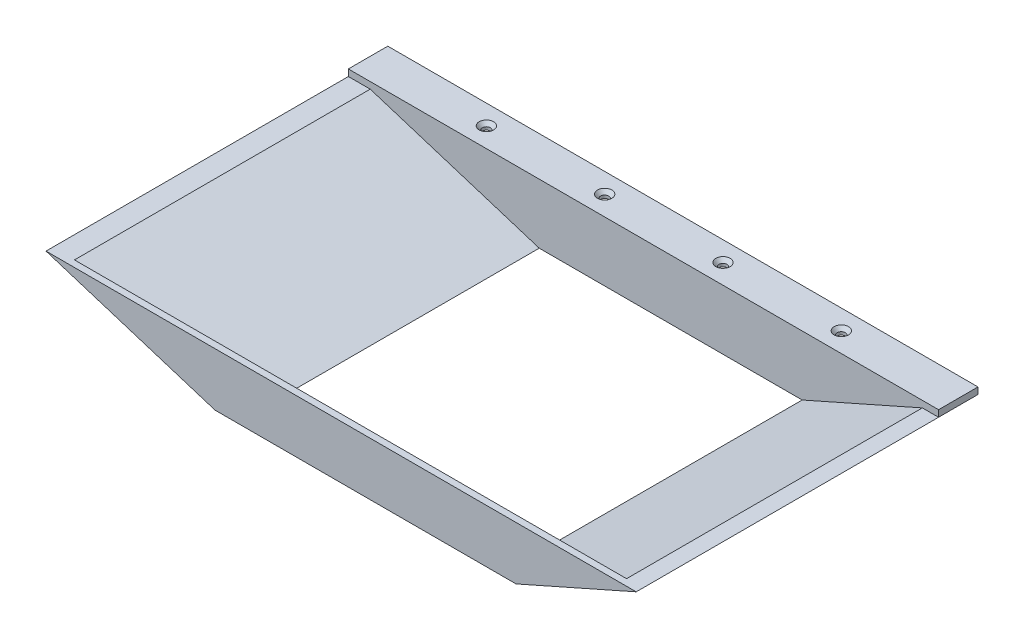
ISO-10303-21;
HEADER;
FILE_DESCRIPTION(('STEP AP214'),'2;1');
FILE_NAME('part.step','',(''),(''),'','','');
FILE_SCHEMA(('AUTOMOTIVE_DESIGN { 1 0 10303 214 1 1 1 1 }'));
ENDSEC;
DATA;
#1=APPLICATION_CONTEXT('core data for automotive mechanical design processes');
#2=APPLICATION_PROTOCOL_DEFINITION('international standard','automotive_design',2000,#1);
#3=PRODUCT_CONTEXT('',#1,'mechanical');
#4=PRODUCT('Part','Part','',(#3));
#5=PRODUCT_RELATED_PRODUCT_CATEGORY('part','',(#4));
#6=PRODUCT_DEFINITION_FORMATION('','',#4);
#7=PRODUCT_DEFINITION_CONTEXT('part definition',#1,'design');
#8=PRODUCT_DEFINITION('design','',#6,#7);
#9=PRODUCT_DEFINITION_SHAPE('','',#8);
#10=(LENGTH_UNIT() NAMED_UNIT(*) SI_UNIT(.MILLI.,.METRE.));
#11=(NAMED_UNIT(*) PLANE_ANGLE_UNIT() SI_UNIT($,.RADIAN.));
#12=(NAMED_UNIT(*) SI_UNIT($,.STERADIAN.) SOLID_ANGLE_UNIT());
#13=UNCERTAINTY_MEASURE_WITH_UNIT(LENGTH_MEASURE(1.E-05),#10,'distance_accuracy_value','');
#14=(GEOMETRIC_REPRESENTATION_CONTEXT(3) GLOBAL_UNCERTAINTY_ASSIGNED_CONTEXT((#13)) GLOBAL_UNIT_ASSIGNED_CONTEXT((#10,
#11,#12)) REPRESENTATION_CONTEXT('',''));
#15=CARTESIAN_POINT('',(0.,0.,0.));
#16=DIRECTION('',(0.,0.,1.));
#17=DIRECTION('',(1.,0.,0.));
#18=AXIS2_PLACEMENT_3D('',#15,#16,#17);
#19=CARTESIAN_POINT('',(0.,41.148,0.));
#20=DIRECTION('',(0.,1.,0.));
#21=DIRECTION('',(0.,0.,1.));
#22=AXIS2_PLACEMENT_3D('',#19,#20,#21);
#23=PLANE('',#22);
#24=DIRECTION('',(1.,0.,0.));
#25=VECTOR('',#24,1.);
#26=CARTESIAN_POINT('',(-249.139939759844,41.148,-114.3));
#27=LINE('',#26,#25);
#28=CARTESIAN_POINT('',(-249.139939759844,41.148,-114.3));
#29=VERTEX_POINT('',#28);
#30=CARTESIAN_POINT('',(-232.231438,41.148,-114.3));
#31=VERTEX_POINT('',#30);
#32=EDGE_CURVE('E63',#29,#31,#27,.T.);
#33=ORIENTED_EDGE('',*,*,#32,.F.);
#34=DIRECTION('',(0.,0.,1.));
#35=VECTOR('',#34,1.);
#36=CARTESIAN_POINT('',(-249.139939759844,41.148,0.));
#37=LINE('',#36,#35);
#38=CARTESIAN_POINT('',(-249.139939759844,41.148,119.38));
#39=VERTEX_POINT('',#38);
#40=EDGE_CURVE('E212',#29,#39,#37,.T.);
#41=ORIENTED_EDGE('',*,*,#40,.T.);
#42=DIRECTION('',(1.,0.,0.));
#43=VECTOR('',#42,1.);
#44=CARTESIAN_POINT('',(0.,41.148,119.38));
#45=LINE('',#44,#43);
#46=CARTESIAN_POINT('',(207.027983743236,41.148,119.38));
#47=VERTEX_POINT('',#46);
#48=EDGE_CURVE('E214',#39,#47,#45,.T.);
#49=ORIENTED_EDGE('',*,*,#48,.T.);
#50=DIRECTION('',(0.,0.,-1.));
#51=VECTOR('',#50,1.);
#52=CARTESIAN_POINT('',(207.027983743236,41.148,0.));
#53=LINE('',#52,#51);
#54=CARTESIAN_POINT('',(207.027983743236,41.148,-114.3));
#55=VERTEX_POINT('',#54);
#56=EDGE_CURVE('E217',#47,#55,#53,.T.);
#57=ORIENTED_EDGE('',*,*,#56,.T.);
#58=CARTESIAN_POINT('',(194.485768,41.148,-114.3));
#59=VERTEX_POINT('',#58);
#60=EDGE_CURVE('E12',#59,#55,#27,.T.);
#61=ORIENTED_EDGE('',*,*,#60,.F.);
#62=DIRECTION('',(0.,0.,-1.));
#63=VECTOR('',#62,1.);
#64=CARTESIAN_POINT('',(194.485768,41.148,-114.3));
#65=LINE('',#64,#63);
#66=CARTESIAN_POINT('',(194.485768,41.148,114.3));
#67=VERTEX_POINT('',#66);
#68=EDGE_CURVE('E187',#67,#59,#65,.T.);
#69=ORIENTED_EDGE('',*,*,#68,.F.);
#70=DIRECTION('',(1.,0.,0.));
#71=VECTOR('',#70,1.);
#72=CARTESIAN_POINT('',(-232.231438,41.148,114.3));
#73=LINE('',#72,#71);
#74=CARTESIAN_POINT('',(-232.231438,41.148,114.3));
#75=VERTEX_POINT('',#74);
#76=EDGE_CURVE('E191',#75,#67,#73,.T.);
#77=ORIENTED_EDGE('',*,*,#76,.F.);
#78=DIRECTION('',(0.,0.,1.));
#79=VECTOR('',#78,1.);
#80=CARTESIAN_POINT('',(-232.231438,41.148,-114.3));
#81=LINE('',#80,#79);
#82=EDGE_CURVE('E192',#31,#75,#81,.T.);
#83=ORIENTED_EDGE('',*,*,#82,.F.);
#84=EDGE_LOOP('',(#33,#41,#49,#57,#61,#69,#77,#83));
#85=FACE_BOUND('',#84,.T.);
#86=ADVANCED_FACE('F46',(#85),#23,.T.);
#87=CARTESIAN_POINT('',(0.,0.,0.));
#88=DIRECTION('',(0.,-1.,0.));
#89=DIRECTION('',(0.,0.,-1.));
#90=AXIS2_PLACEMENT_3D('',#87,#88,#89);
#91=PLANE('',#90);
#92=DIRECTION('',(0.,0.,-1.));
#93=VECTOR('',#92,1.);
#94=CARTESIAN_POINT('',(101.6,0.,114.3));
#95=LINE('',#94,#93);
#96=CARTESIAN_POINT('',(101.6,0.,114.3));
#97=VERTEX_POINT('',#96);
#98=CARTESIAN_POINT('',(101.6,0.,-114.3));
#99=VERTEX_POINT('',#98);
#100=EDGE_CURVE('E161',#97,#99,#95,.T.);
#101=ORIENTED_EDGE('',*,*,#100,.T.);
#102=DIRECTION('',(-1.,0.,0.));
#103=VECTOR('',#102,1.);
#104=CARTESIAN_POINT('',(-101.6,0.,-114.3));
#105=LINE('',#104,#103);
#106=CARTESIAN_POINT('',(-101.6,0.,-114.3));
#107=VERTEX_POINT('',#106);
#108=EDGE_CURVE('E164',#99,#107,#105,.T.);
#109=ORIENTED_EDGE('',*,*,#108,.T.);
#110=DIRECTION('',(0.,0.,1.));
#111=VECTOR('',#110,1.);
#112=CARTESIAN_POINT('',(-101.6,0.,114.3));
#113=LINE('',#112,#111);
#114=CARTESIAN_POINT('',(-101.6,0.,114.3));
#115=VERTEX_POINT('',#114);
#116=EDGE_CURVE('E238',#107,#115,#113,.T.);
#117=ORIENTED_EDGE('',*,*,#116,.T.);
#118=DIRECTION('',(1.,0.,0.));
#119=VECTOR('',#118,1.);
#120=CARTESIAN_POINT('',(-101.6,0.,114.3));
#121=LINE('',#120,#119);
#122=EDGE_CURVE('E290',#115,#97,#121,.T.);
#123=ORIENTED_EDGE('',*,*,#122,.T.);
#124=EDGE_LOOP('',(#101,#109,#117,#123));
#125=FACE_BOUND('',#124,.T.);
#126=DIRECTION('',(0.,0.,-1.));
#127=VECTOR('',#126,1.);
#128=CARTESIAN_POINT('',(114.142215743236,0.,0.));
#129=LINE('',#128,#127);
#130=CARTESIAN_POINT('',(114.142215743236,0.,119.38));
#131=VERTEX_POINT('',#130);
#132=CARTESIAN_POINT('',(114.142215743236,0.,-119.38));
#133=VERTEX_POINT('',#132);
#134=EDGE_CURVE('E190',#131,#133,#129,.T.);
#135=ORIENTED_EDGE('',*,*,#134,.F.);
#136=DIRECTION('',(1.,0.,0.));
#137=VECTOR('',#136,1.);
#138=CARTESIAN_POINT('',(0.,-1.34386598499686E-13,119.38));
#139=LINE('',#138,#137);
#140=CARTESIAN_POINT('',(-118.508501759844,0.,119.38));
#141=VERTEX_POINT('',#140);
#142=EDGE_CURVE('E205',#141,#131,#139,.T.);
#143=ORIENTED_EDGE('',*,*,#142,.F.);
#144=DIRECTION('',(0.,0.,1.));
#145=VECTOR('',#144,1.);
#146=CARTESIAN_POINT('',(-118.508501759844,0.,0.));
#147=LINE('',#146,#145);
#148=CARTESIAN_POINT('',(-118.508501759844,0.,-119.38));
#149=VERTEX_POINT('',#148);
#150=EDGE_CURVE('E224',#149,#141,#147,.T.);
#151=ORIENTED_EDGE('',*,*,#150,.F.);
#152=DIRECTION('',(-1.,0.,0.));
#153=VECTOR('',#152,1.);
#154=CARTESIAN_POINT('',(0.,0.,-119.38));
#155=LINE('',#154,#153);
#156=EDGE_CURVE('E227',#133,#149,#155,.T.);
#157=ORIENTED_EDGE('',*,*,#156,.F.);
#158=EDGE_LOOP('',(#135,#143,#151,#157));
#159=FACE_BOUND('',#158,.T.);
#160=ADVANCED_FACE('F244',(#125,#159),#91,.T.);
#161=CARTESIAN_POINT('',(0.,-1.34386598499686E-13,119.38));
#162=DIRECTION('',(0.,0.,1.));
#163=DIRECTION('',(0.,-1.,0.));
#164=AXIS2_PLACEMENT_3D('',#161,#162,#163);
#165=PLANE('',#164);
#166=DIRECTION('',(0.914302464587744,0.405032101504038,0.));
#167=VECTOR('',#166,1.);
#168=CARTESIAN_POINT('',(18.7251450057162,-42.269356342163,119.38));
#169=LINE('',#168,#167);
#170=EDGE_CURVE('E201',#131,#47,#169,.T.);
#171=ORIENTED_EDGE('',*,*,#170,.T.);
#172=ORIENTED_EDGE('',*,*,#48,.F.);
#173=DIRECTION('',(-0.95380053500612,0.300440575525409,0.));
#174=VECTOR('',#173,1.);
#175=CARTESIAN_POINT('',(-10.6971153289482,-33.9598414958772,119.38));
#176=LINE('',#175,#174);
#177=EDGE_CURVE('E204',#141,#39,#176,.T.);
#178=ORIENTED_EDGE('',*,*,#177,.F.);
#179=ORIENTED_EDGE('',*,*,#142,.T.);
#180=EDGE_LOOP('',(#171,#172,#178,#179));
#181=FACE_BOUND('',#180,.T.);
#182=ADVANCED_FACE('F254',(#181),#165,.T.);
#183=CARTESIAN_POINT('',(-10.6971153289483,-33.9598414958772,0.));
#184=DIRECTION('',(0.300440575525409,0.95380053500612,0.));
#185=DIRECTION('',(-0.95380053500612,0.300440575525409,0.));
#186=AXIS2_PLACEMENT_3D('',#183,#184,#185);
#187=PLANE('',#186);
#188=ORIENTED_EDGE('',*,*,#177,.T.);
#189=ORIENTED_EDGE('',*,*,#40,.F.);
#190=CARTESIAN_POINT('',(-249.139939759844,41.148,-119.38));
#191=VERTEX_POINT('',#190);
#192=EDGE_CURVE('E160',#191,#29,#37,.T.);
#193=ORIENTED_EDGE('',*,*,#192,.F.);
#194=DIRECTION('',(-0.95380053500612,0.300440575525409,0.));
#195=VECTOR('',#194,1.);
#196=CARTESIAN_POINT('',(-10.6971153289483,-33.9598414958772,-119.38));
#197=LINE('',#196,#195);
#198=EDGE_CURVE('E209',#149,#191,#197,.T.);
#199=ORIENTED_EDGE('',*,*,#198,.F.);
#200=ORIENTED_EDGE('',*,*,#150,.T.);
#201=EDGE_LOOP('',(#188,#189,#193,#199,#200));
#202=FACE_BOUND('',#201,.T.);
#203=ADVANCED_FACE('F456',(#202),#187,.F.);
#204=CARTESIAN_POINT('',(18.7251450057163,-42.2693563421629,0.));
#205=DIRECTION('',(-0.405032101504038,0.914302464587744,0.));
#206=DIRECTION('',(-0.914302464587744,-0.405032101504038,0.));
#207=AXIS2_PLACEMENT_3D('',#204,#205,#206);
#208=PLANE('',#207);
#209=DIRECTION('',(0.914302464587744,0.405032101504038,0.));
#210=VECTOR('',#209,1.);
#211=CARTESIAN_POINT('',(18.7251450057162,-42.269356342163,-119.38));
#212=LINE('',#211,#210);
#213=CARTESIAN_POINT('',(207.027983743236,41.148,-119.38));
#214=VERTEX_POINT('',#213);
#215=EDGE_CURVE('E208',#133,#214,#212,.T.);
#216=ORIENTED_EDGE('',*,*,#215,.T.);
#217=DIRECTION('',(0.,0.,-1.));
#218=VECTOR('',#217,1.);
#219=CARTESIAN_POINT('',(207.027983743236,41.148,-114.3));
#220=LINE('',#219,#218);
#221=EDGE_CURVE('E180',#55,#214,#220,.T.);
#222=ORIENTED_EDGE('',*,*,#221,.F.);
#223=ORIENTED_EDGE('',*,*,#56,.F.);
#224=ORIENTED_EDGE('',*,*,#170,.F.);
#225=ORIENTED_EDGE('',*,*,#134,.T.);
#226=EDGE_LOOP('',(#216,#222,#223,#224,#225));
#227=FACE_BOUND('',#226,.T.);
#228=ADVANCED_FACE('F365',(#227),#208,.F.);
#229=CARTESIAN_POINT('',(0.,0.,-119.38));
#230=DIRECTION('',(0.,0.,-1.));
#231=DIRECTION('',(0.,1.,0.));
#232=AXIS2_PLACEMENT_3D('',#229,#230,#231);
#233=PLANE('',#232);
#234=ORIENTED_EDGE('',*,*,#198,.T.);
#235=DIRECTION('',(-1.,0.,0.));
#236=VECTOR('',#235,1.);
#237=CARTESIAN_POINT('',(0.,41.148,-119.38));
#238=LINE('',#237,#236);
#239=EDGE_CURVE('E55',#214,#191,#238,.T.);
#240=ORIENTED_EDGE('',*,*,#239,.F.);
#241=ORIENTED_EDGE('',*,*,#215,.F.);
#242=ORIENTED_EDGE('',*,*,#156,.T.);
#243=EDGE_LOOP('',(#234,#240,#241,#242));
#244=FACE_BOUND('',#243,.T.);
#245=ADVANCED_FACE('F48',(#244),#233,.T.);
#246=CARTESIAN_POINT('',(0.,-1.28668019840125E-13,114.3));
#247=DIRECTION('',(0.,0.,1.));
#248=DIRECTION('',(0.,-1.,0.));
#249=AXIS2_PLACEMENT_3D('',#246,#247,#248);
#250=PLANE('',#249);
#251=DIRECTION('',(0.914302464587744,0.405032101504038,0.));
#252=VECTOR('',#251,1.);
#253=CARTESIAN_POINT('',(101.6,0.,114.3));
#254=LINE('',#253,#252);
#255=EDGE_CURVE('E292',#97,#67,#254,.T.);
#256=ORIENTED_EDGE('',*,*,#255,.F.);
#257=ORIENTED_EDGE('',*,*,#122,.F.);
#258=DIRECTION('',(-0.95380053500612,0.300440575525409,0.));
#259=VECTOR('',#258,1.);
#260=CARTESIAN_POINT('',(-101.6,0.,114.3));
#261=LINE('',#260,#259);
#262=EDGE_CURVE('E174',#115,#75,#261,.T.);
#263=ORIENTED_EDGE('',*,*,#262,.T.);
#264=ORIENTED_EDGE('',*,*,#76,.T.);
#265=EDGE_LOOP('',(#256,#257,#263,#264));
#266=FACE_BOUND('',#265,.T.);
#267=ADVANCED_FACE('F356',(#266),#250,.F.);
#268=CARTESIAN_POINT('',(-9.17087720527918,-29.1145347780461,0.));
#269=DIRECTION('',(0.300440575525409,0.95380053500612,0.));
#270=DIRECTION('',(-0.95380053500612,0.300440575525409,0.));
#271=AXIS2_PLACEMENT_3D('',#268,#269,#270);
#272=PLANE('',#271);
#273=ORIENTED_EDGE('',*,*,#262,.F.);
#274=ORIENTED_EDGE('',*,*,#116,.F.);
#275=DIRECTION('',(-0.95380053500612,0.300440575525409,0.));
#276=VECTOR('',#275,1.);
#277=CARTESIAN_POINT('',(-101.6,0.,-114.3));
#278=LINE('',#277,#276);
#279=EDGE_CURVE('E330',#107,#31,#278,.T.);
#280=ORIENTED_EDGE('',*,*,#279,.T.);
#281=ORIENTED_EDGE('',*,*,#82,.T.);
#282=EDGE_LOOP('',(#273,#274,#280,#281));
#283=FACE_BOUND('',#282,.T.);
#284=ADVANCED_FACE('F310',(#283),#272,.T.);
#285=CARTESIAN_POINT('',(16.6675819300758,-37.6246998220572,0.));
#286=DIRECTION('',(-0.405032101504038,0.914302464587744,0.));
#287=DIRECTION('',(-0.914302464587744,-0.405032101504038,0.));
#288=AXIS2_PLACEMENT_3D('',#285,#286,#287);
#289=PLANE('',#288);
#290=DIRECTION('',(0.914302464587744,0.405032101504038,0.));
#291=VECTOR('',#290,1.);
#292=CARTESIAN_POINT('',(101.6,0.,-114.3));
#293=LINE('',#292,#291);
#294=EDGE_CURVE('E322',#99,#59,#293,.T.);
#295=ORIENTED_EDGE('',*,*,#294,.F.);
#296=ORIENTED_EDGE('',*,*,#100,.F.);
#297=ORIENTED_EDGE('',*,*,#255,.T.);
#298=ORIENTED_EDGE('',*,*,#68,.T.);
#299=EDGE_LOOP('',(#295,#296,#297,#298));
#300=FACE_BOUND('',#299,.T.);
#301=ADVANCED_FACE('F301',(#300),#289,.T.);
#302=CARTESIAN_POINT('',(0.,0.,-114.3));
#303=DIRECTION('',(0.,0.,-1.));
#304=DIRECTION('',(0.,1.,0.));
#305=AXIS2_PLACEMENT_3D('',#302,#303,#304);
#306=PLANE('',#305);
#307=ORIENTED_EDGE('',*,*,#279,.F.);
#308=ORIENTED_EDGE('',*,*,#108,.F.);
#309=ORIENTED_EDGE('',*,*,#294,.T.);
#310=ORIENTED_EDGE('',*,*,#60,.T.);
#311=DIRECTION('',(0.,-1.,0.));
#312=VECTOR('',#311,1.);
#313=CARTESIAN_POINT('',(207.027983743236,46.228,-114.3));
#314=LINE('',#313,#312);
#315=CARTESIAN_POINT('',(207.027983743236,46.228,-114.3));
#316=VERTEX_POINT('',#315);
#317=EDGE_CURVE('E142',#316,#55,#314,.T.);
#318=ORIENTED_EDGE('',*,*,#317,.F.);
#319=DIRECTION('',(1.,0.,0.));
#320=VECTOR('',#319,1.);
#321=CARTESIAN_POINT('',(-249.139939759844,46.228,-114.3));
#322=LINE('',#321,#320);
#323=CARTESIAN_POINT('',(-249.139939759844,46.228,-114.3));
#324=VERTEX_POINT('',#323);
#325=EDGE_CURVE('E136',#324,#316,#322,.T.);
#326=ORIENTED_EDGE('',*,*,#325,.F.);
#327=DIRECTION('',(0.,-1.,0.));
#328=VECTOR('',#327,1.);
#329=CARTESIAN_POINT('',(-249.139939759844,46.228,-114.3));
#330=LINE('',#329,#328);
#331=EDGE_CURVE('E140',#324,#29,#330,.T.);
#332=ORIENTED_EDGE('',*,*,#331,.T.);
#333=ORIENTED_EDGE('',*,*,#32,.T.);
#334=EDGE_LOOP('',(#307,#308,#309,#310,#318,#326,#332,#333));
#335=FACE_BOUND('',#334,.T.);
#336=ADVANCED_FACE('F138',(#335),#306,.F.);
#337=CARTESIAN_POINT('',(-249.139939759844,46.228,-114.3));
#338=DIRECTION('',(1.,0.,0.));
#339=DIRECTION('',(0.,0.,-1.));
#340=AXIS2_PLACEMENT_3D('',#337,#338,#339);
#341=PLANE('',#340);
#342=DIRECTION('',(0.,0.,1.));
#343=VECTOR('',#342,1.);
#344=CARTESIAN_POINT('',(-249.139939759844,41.148,-114.3));
#345=LINE('',#344,#343);
#346=CARTESIAN_POINT('',(-249.139939759844,41.148,-144.78));
#347=VERTEX_POINT('',#346);
#348=EDGE_CURVE('E173',#347,#191,#345,.T.);
#349=ORIENTED_EDGE('',*,*,#348,.T.);
#350=ORIENTED_EDGE('',*,*,#192,.T.);
#351=ORIENTED_EDGE('',*,*,#331,.F.);
#352=DIRECTION('',(0.,0.,1.));
#353=VECTOR('',#352,1.);
#354=CARTESIAN_POINT('',(-249.139939759844,46.228,-114.3));
#355=LINE('',#354,#353);
#356=CARTESIAN_POINT('',(-249.139939759844,46.228,-144.78));
#357=VERTEX_POINT('',#356);
#358=EDGE_CURVE('E146',#357,#324,#355,.T.);
#359=ORIENTED_EDGE('',*,*,#358,.F.);
#360=DIRECTION('',(0.,-1.,0.));
#361=VECTOR('',#360,1.);
#362=CARTESIAN_POINT('',(-249.139939759844,46.228,-144.78));
#363=LINE('',#362,#361);
#364=EDGE_CURVE('E382',#357,#347,#363,.T.);
#365=ORIENTED_EDGE('',*,*,#364,.T.);
#366=EDGE_LOOP('',(#349,#350,#351,#359,#365));
#367=FACE_BOUND('',#366,.T.);
#368=ADVANCED_FACE('F159',(#367),#341,.F.);
#369=CARTESIAN_POINT('',(207.027983743236,46.228,-114.3));
#370=DIRECTION('',(-1.,0.,0.));
#371=DIRECTION('',(0.,0.,1.));
#372=AXIS2_PLACEMENT_3D('',#369,#370,#371);
#373=PLANE('',#372);
#374=ORIENTED_EDGE('',*,*,#221,.T.);
#375=CARTESIAN_POINT('',(207.027983743236,41.148,-144.78));
#376=VERTEX_POINT('',#375);
#377=EDGE_CURVE('E172',#214,#376,#220,.T.);
#378=ORIENTED_EDGE('',*,*,#377,.T.);
#379=DIRECTION('',(0.,-1.,0.));
#380=VECTOR('',#379,1.);
#381=CARTESIAN_POINT('',(207.027983743236,46.228,-144.78));
#382=LINE('',#381,#380);
#383=CARTESIAN_POINT('',(207.027983743236,46.228,-144.78));
#384=VERTEX_POINT('',#383);
#385=EDGE_CURVE('E166',#384,#376,#382,.T.);
#386=ORIENTED_EDGE('',*,*,#385,.F.);
#387=DIRECTION('',(0.,0.,-1.));
#388=VECTOR('',#387,1.);
#389=CARTESIAN_POINT('',(207.027983743236,46.228,-114.3));
#390=LINE('',#389,#388);
#391=EDGE_CURVE('E145',#316,#384,#390,.T.);
#392=ORIENTED_EDGE('',*,*,#391,.F.);
#393=ORIENTED_EDGE('',*,*,#317,.T.);
#394=EDGE_LOOP('',(#374,#378,#386,#392,#393));
#395=FACE_BOUND('',#394,.T.);
#396=ADVANCED_FACE('F379',(#395),#373,.F.);
#397=CARTESIAN_POINT('',(-249.139939759844,46.228,-144.78));
#398=DIRECTION('',(0.,0.,1.));
#399=DIRECTION('',(1.,0.,0.));
#400=AXIS2_PLACEMENT_3D('',#397,#398,#399);
#401=PLANE('',#400);
#402=DIRECTION('',(-1.,0.,0.));
#403=VECTOR('',#402,1.);
#404=CARTESIAN_POINT('',(-249.139939759844,41.148,-144.78));
#405=LINE('',#404,#403);
#406=EDGE_CURVE('E155',#376,#347,#405,.T.);
#407=ORIENTED_EDGE('',*,*,#406,.T.);
#408=ORIENTED_EDGE('',*,*,#364,.F.);
#409=DIRECTION('',(-1.,0.,0.));
#410=VECTOR('',#409,1.);
#411=CARTESIAN_POINT('',(-249.139939759844,46.228,-144.78));
#412=LINE('',#411,#410);
#413=EDGE_CURVE('E151',#384,#357,#412,.T.);
#414=ORIENTED_EDGE('',*,*,#413,.F.);
#415=ORIENTED_EDGE('',*,*,#385,.T.);
#416=EDGE_LOOP('',(#407,#408,#414,#415));
#417=FACE_BOUND('',#416,.T.);
#418=ADVANCED_FACE('F383',(#417),#401,.F.);
#419=CARTESIAN_POINT('',(0.,46.228,0.));
#420=DIRECTION('',(0.,-1.,0.));
#421=DIRECTION('',(0.,0.,-1.));
#422=AXIS2_PLACEMENT_3D('',#419,#420,#421);
#423=PLANE('',#422);
#424=CARTESIAN_POINT('',(-157.699939759844,46.228,-129.54));
#425=DIRECTION('',(0.,1.,0.));
#426=DIRECTION('',(0.,0.,1.));
#427=AXIS2_PLACEMENT_3D('',#424,#425,#426);
#428=CIRCLE('',#427,5.5626);
#429=CARTESIAN_POINT('',(-157.699939759844,46.228,-123.9774));
#430=VERTEX_POINT('',#429);
#431=EDGE_CURVE('E410',#430,#430,#428,.T.);
#432=ORIENTED_EDGE('',*,*,#431,.F.);
#433=EDGE_LOOP('',(#432));
#434=FACE_BOUND('',#433,.T.);
#435=CARTESIAN_POINT('',(-66.2599397598442,46.228,-129.54));
#436=DIRECTION('',(0.,1.,0.));
#437=DIRECTION('',(0.,0.,1.));
#438=AXIS2_PLACEMENT_3D('',#435,#436,#437);
#439=CIRCLE('',#438,5.5626);
#440=CARTESIAN_POINT('',(-66.2599397598442,46.228,-123.9774));
#441=VERTEX_POINT('',#440);
#442=EDGE_CURVE('E404',#441,#441,#439,.T.);
#443=ORIENTED_EDGE('',*,*,#442,.F.);
#444=EDGE_LOOP('',(#443));
#445=FACE_BOUND('',#444,.T.);
#446=CARTESIAN_POINT('',(25.1800602401557,46.228,-129.54));
#447=DIRECTION('',(0.,1.,0.));
#448=DIRECTION('',(0.,0.,1.));
#449=AXIS2_PLACEMENT_3D('',#446,#447,#448);
#450=CIRCLE('',#449,5.5626);
#451=CARTESIAN_POINT('',(25.1800602401557,46.228,-123.9774));
#452=VERTEX_POINT('',#451);
#453=EDGE_CURVE('E397',#452,#452,#450,.T.);
#454=ORIENTED_EDGE('',*,*,#453,.F.);
#455=EDGE_LOOP('',(#454));
#456=FACE_BOUND('',#455,.T.);
#457=CARTESIAN_POINT('',(116.620060240156,46.228,-129.54));
#458=DIRECTION('',(0.,1.,0.));
#459=DIRECTION('',(0.,0.,1.));
#460=AXIS2_PLACEMENT_3D('',#457,#458,#459);
#461=CIRCLE('',#460,5.5626);
#462=CARTESIAN_POINT('',(116.620060240156,46.228,-123.9774));
#463=VERTEX_POINT('',#462);
#464=EDGE_CURVE('E390',#463,#463,#461,.T.);
#465=ORIENTED_EDGE('',*,*,#464,.F.);
#466=EDGE_LOOP('',(#465));
#467=FACE_BOUND('',#466,.T.);
#468=ORIENTED_EDGE('',*,*,#358,.T.);
#469=ORIENTED_EDGE('',*,*,#325,.T.);
#470=ORIENTED_EDGE('',*,*,#391,.T.);
#471=ORIENTED_EDGE('',*,*,#413,.T.);
#472=EDGE_LOOP('',(#468,#469,#470,#471));
#473=FACE_BOUND('',#472,.T.);
#474=ADVANCED_FACE('F149',(#434,#445,#456,#467,#473),#423,.F.);
#475=CARTESIAN_POINT('',(0.,41.148,0.));
#476=DIRECTION('',(0.,-1.,0.));
#477=DIRECTION('',(0.,0.,-1.));
#478=AXIS2_PLACEMENT_3D('',#475,#476,#477);
#479=PLANE('',#478);
#480=CARTESIAN_POINT('',(-157.699939759844,41.148,-129.54));
#481=DIRECTION('',(0.,-1.,0.));
#482=DIRECTION('',(0.,0.,-1.));
#483=AXIS2_PLACEMENT_3D('',#480,#481,#482);
#484=CIRCLE('',#483,3.12419999999999);
#485=CARTESIAN_POINT('',(-157.699939759844,41.148,-132.6642));
#486=VERTEX_POINT('',#485);
#487=EDGE_CURVE('E50',#486,#486,#484,.T.);
#488=ORIENTED_EDGE('',*,*,#487,.F.);
#489=EDGE_LOOP('',(#488));
#490=FACE_BOUND('',#489,.T.);
#491=CARTESIAN_POINT('',(-66.2599397598442,41.148,-129.54));
#492=DIRECTION('',(0.,-1.,0.));
#493=DIRECTION('',(0.,0.,-1.));
#494=AXIS2_PLACEMENT_3D('',#491,#492,#493);
#495=CIRCLE('',#494,3.12419999999999);
#496=CARTESIAN_POINT('',(-66.2599397598442,41.148,-132.6642));
#497=VERTEX_POINT('',#496);
#498=EDGE_CURVE('E400',#497,#497,#495,.T.);
#499=ORIENTED_EDGE('',*,*,#498,.F.);
#500=EDGE_LOOP('',(#499));
#501=FACE_BOUND('',#500,.T.);
#502=CARTESIAN_POINT('',(25.1800602401557,41.148,-129.54));
#503=DIRECTION('',(0.,-1.,0.));
#504=DIRECTION('',(0.,0.,-1.));
#505=AXIS2_PLACEMENT_3D('',#502,#503,#504);
#506=CIRCLE('',#505,3.1242);
#507=CARTESIAN_POINT('',(25.1800602401557,41.148,-132.6642));
#508=VERTEX_POINT('',#507);
#509=EDGE_CURVE('E393',#508,#508,#506,.T.);
#510=ORIENTED_EDGE('',*,*,#509,.F.);
#511=EDGE_LOOP('',(#510));
#512=FACE_BOUND('',#511,.T.);
#513=CARTESIAN_POINT('',(116.620060240156,41.148,-129.54));
#514=DIRECTION('',(0.,-1.,0.));
#515=DIRECTION('',(0.,0.,-1.));
#516=AXIS2_PLACEMENT_3D('',#513,#514,#515);
#517=CIRCLE('',#516,3.12419999999999);
#518=CARTESIAN_POINT('',(116.620060240156,41.148,-132.6642));
#519=VERTEX_POINT('',#518);
#520=EDGE_CURVE('E389',#519,#519,#517,.T.);
#521=ORIENTED_EDGE('',*,*,#520,.F.);
#522=EDGE_LOOP('',(#521));
#523=FACE_BOUND('',#522,.T.);
#524=ORIENTED_EDGE('',*,*,#377,.F.);
#525=ORIENTED_EDGE('',*,*,#239,.T.);
#526=ORIENTED_EDGE('',*,*,#348,.F.);
#527=ORIENTED_EDGE('',*,*,#406,.F.);
#528=EDGE_LOOP('',(#524,#525,#526,#527));
#529=FACE_BOUND('',#528,.T.);
#530=ADVANCED_FACE('F375',(#490,#501,#512,#523,#529),#479,.T.);
#531=CARTESIAN_POINT('',(116.620060240156,46.228,-129.54));
#532=DIRECTION('',(0.,1.,0.));
#533=DIRECTION('',(0.,0.,1.));
#534=AXIS2_PLACEMENT_3D('',#531,#532,#533);
#535=CYLINDRICAL_SURFACE('',#534,3.12419999999999);
#536=ORIENTED_EDGE('',*,*,#520,.T.);
#537=EDGE_LOOP('',(#536));
#538=FACE_BOUND('',#537,.T.);
#539=CARTESIAN_POINT('',(116.620060240156,43.4229416758323,-129.54));
#540=DIRECTION('',(0.,1.,0.));
#541=DIRECTION('',(0.,0.,1.));
#542=AXIS2_PLACEMENT_3D('',#539,#540,#541);
#543=CIRCLE('',#542,3.12419999999999);
#544=CARTESIAN_POINT('',(116.620060240156,43.4229416758323,-126.4158));
#545=VERTEX_POINT('',#544);
#546=EDGE_CURVE('E386',#545,#545,#543,.T.);
#547=ORIENTED_EDGE('',*,*,#546,.T.);
#548=EDGE_LOOP('',(#547));
#549=FACE_BOUND('',#548,.T.);
#550=ADVANCED_FACE('F428',(#538,#549),#535,.F.);
#551=CARTESIAN_POINT('',(116.620060240156,46.228,-129.54));
#552=DIRECTION('',(0.,1.,0.));
#553=DIRECTION('',(0.,0.,1.));
#554=AXIS2_PLACEMENT_3D('',#551,#552,#553);
#555=CONICAL_SURFACE('',#554,5.5626,0.715584993317677);
#556=ORIENTED_EDGE('',*,*,#546,.F.);
#557=EDGE_LOOP('',(#556));
#558=FACE_BOUND('',#557,.T.);
#559=ORIENTED_EDGE('',*,*,#464,.T.);
#560=EDGE_LOOP('',(#559));
#561=FACE_BOUND('',#560,.T.);
#562=ADVANCED_FACE('F425',(#558,#561),#555,.F.);
#563=CARTESIAN_POINT('',(25.1800602401557,46.228,-129.54));
#564=DIRECTION('',(0.,1.,0.));
#565=DIRECTION('',(0.,0.,1.));
#566=AXIS2_PLACEMENT_3D('',#563,#564,#565);
#567=CYLINDRICAL_SURFACE('',#566,3.1242);
#568=ORIENTED_EDGE('',*,*,#509,.T.);
#569=EDGE_LOOP('',(#568));
#570=FACE_BOUND('',#569,.T.);
#571=CARTESIAN_POINT('',(25.1800602401557,43.4229416758323,-129.54));
#572=DIRECTION('',(0.,1.,0.));
#573=DIRECTION('',(0.,0.,1.));
#574=AXIS2_PLACEMENT_3D('',#571,#572,#573);
#575=CIRCLE('',#574,3.1242);
#576=CARTESIAN_POINT('',(25.1800602401557,43.4229416758323,-126.4158));
#577=VERTEX_POINT('',#576);
#578=EDGE_CURVE('E394',#577,#577,#575,.T.);
#579=ORIENTED_EDGE('',*,*,#578,.T.);
#580=EDGE_LOOP('',(#579));
#581=FACE_BOUND('',#580,.T.);
#582=ADVANCED_FACE('F427',(#570,#581),#567,.F.);
#583=CARTESIAN_POINT('',(25.1800602401557,46.228,-129.54));
#584=DIRECTION('',(0.,1.,0.));
#585=DIRECTION('',(0.,0.,1.));
#586=AXIS2_PLACEMENT_3D('',#583,#584,#585);
#587=CONICAL_SURFACE('',#586,5.5626,0.715584993317676);
#588=ORIENTED_EDGE('',*,*,#578,.F.);
#589=EDGE_LOOP('',(#588));
#590=FACE_BOUND('',#589,.T.);
#591=ORIENTED_EDGE('',*,*,#453,.T.);
#592=EDGE_LOOP('',(#591));
#593=FACE_BOUND('',#592,.T.);
#594=ADVANCED_FACE('F435',(#590,#593),#587,.F.);
#595=CARTESIAN_POINT('',(-66.2599397598442,46.228,-129.54));
#596=DIRECTION('',(0.,1.,0.));
#597=DIRECTION('',(0.,0.,1.));
#598=AXIS2_PLACEMENT_3D('',#595,#596,#597);
#599=CYLINDRICAL_SURFACE('',#598,3.12419999999999);
#600=ORIENTED_EDGE('',*,*,#498,.T.);
#601=EDGE_LOOP('',(#600));
#602=FACE_BOUND('',#601,.T.);
#603=CARTESIAN_POINT('',(-66.2599397598442,43.4229416758323,-129.54));
#604=DIRECTION('',(0.,1.,0.));
#605=DIRECTION('',(0.,0.,1.));
#606=AXIS2_PLACEMENT_3D('',#603,#604,#605);
#607=CIRCLE('',#606,3.12419999999999);
#608=CARTESIAN_POINT('',(-66.2599397598442,43.4229416758323,-126.4158));
#609=VERTEX_POINT('',#608);
#610=EDGE_CURVE('E401',#609,#609,#607,.T.);
#611=ORIENTED_EDGE('',*,*,#610,.T.);
#612=EDGE_LOOP('',(#611));
#613=FACE_BOUND('',#612,.T.);
#614=ADVANCED_FACE('F543',(#602,#613),#599,.F.);
#615=CARTESIAN_POINT('',(-66.2599397598442,46.228,-129.54));
#616=DIRECTION('',(0.,1.,0.));
#617=DIRECTION('',(0.,0.,1.));
#618=AXIS2_PLACEMENT_3D('',#615,#616,#617);
#619=CONICAL_SURFACE('',#618,5.5626,0.715584993317677);
#620=ORIENTED_EDGE('',*,*,#610,.F.);
#621=EDGE_LOOP('',(#620));
#622=FACE_BOUND('',#621,.T.);
#623=ORIENTED_EDGE('',*,*,#442,.T.);
#624=EDGE_LOOP('',(#623));
#625=FACE_BOUND('',#624,.T.);
#626=ADVANCED_FACE('F553',(#622,#625),#619,.F.);
#627=CARTESIAN_POINT('',(-157.699939759844,46.228,-129.54));
#628=DIRECTION('',(0.,1.,0.));
#629=DIRECTION('',(0.,0.,1.));
#630=AXIS2_PLACEMENT_3D('',#627,#628,#629);
#631=CYLINDRICAL_SURFACE('',#630,3.12419999999999);
#632=ORIENTED_EDGE('',*,*,#487,.T.);
#633=EDGE_LOOP('',(#632));
#634=FACE_BOUND('',#633,.T.);
#635=CARTESIAN_POINT('',(-157.699939759844,43.4229416758323,-129.54));
#636=DIRECTION('',(0.,1.,0.));
#637=DIRECTION('',(0.,0.,1.));
#638=AXIS2_PLACEMENT_3D('',#635,#636,#637);
#639=CIRCLE('',#638,3.12419999999999);
#640=CARTESIAN_POINT('',(-157.699939759844,43.4229416758323,-126.4158));
#641=VERTEX_POINT('',#640);
#642=EDGE_CURVE('E407',#641,#641,#639,.T.);
#643=ORIENTED_EDGE('',*,*,#642,.T.);
#644=EDGE_LOOP('',(#643));
#645=FACE_BOUND('',#644,.T.);
#646=ADVANCED_FACE('F563',(#634,#645),#631,.F.);
#647=CARTESIAN_POINT('',(-157.699939759844,46.228,-129.54));
#648=DIRECTION('',(0.,1.,0.));
#649=DIRECTION('',(0.,0.,1.));
#650=AXIS2_PLACEMENT_3D('',#647,#648,#649);
#651=CONICAL_SURFACE('',#650,5.5626,0.715584993317677);
#652=ORIENTED_EDGE('',*,*,#642,.F.);
#653=EDGE_LOOP('',(#652));
#654=FACE_BOUND('',#653,.T.);
#655=ORIENTED_EDGE('',*,*,#431,.T.);
#656=EDGE_LOOP('',(#655));
#657=FACE_BOUND('',#656,.T.);
#658=ADVANCED_FACE('F414',(#654,#657),#651,.F.);
#659=CLOSED_SHELL('',(#86,#160,#182,#203,#228,#245,#267,#284,#301,#336,#368,#396,#418,#474,#530,
#550,#562,#582,#594,#614,#626,#646,#658));
#660=MANIFOLD_SOLID_BREP('B2',#659);
#661=ADVANCED_BREP_SHAPE_REPRESENTATION('',(#18,#660),#14);
#662=SHAPE_DEFINITION_REPRESENTATION(#9,#661);
ENDSEC;
END-ISO-10303-21;
